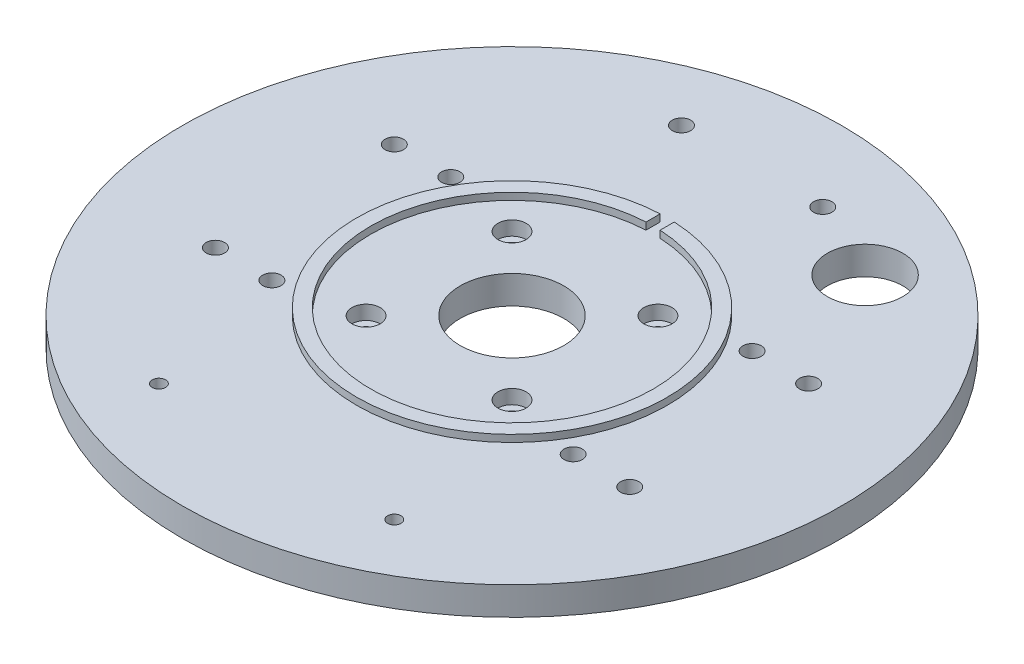
ISO-10303-21;
HEADER;
FILE_DESCRIPTION(('STEP AP214'),'2;1');
FILE_NAME('part.step','',(''),(''),'','','');
FILE_SCHEMA(('AUTOMOTIVE_DESIGN { 1 0 10303 214 1 1 1 1 }'));
ENDSEC;
DATA;
#1=APPLICATION_CONTEXT('core data for automotive mechanical design processes');
#2=APPLICATION_PROTOCOL_DEFINITION('international standard','automotive_design',2000,#1);
#3=PRODUCT_CONTEXT('',#1,'mechanical');
#4=PRODUCT('Part','Part','',(#3));
#5=PRODUCT_RELATED_PRODUCT_CATEGORY('part','',(#4));
#6=PRODUCT_DEFINITION_FORMATION('','',#4);
#7=PRODUCT_DEFINITION_CONTEXT('part definition',#1,'design');
#8=PRODUCT_DEFINITION('design','',#6,#7);
#9=PRODUCT_DEFINITION_SHAPE('','',#8);
#10=(LENGTH_UNIT() NAMED_UNIT(*) SI_UNIT(.MILLI.,.METRE.));
#11=(NAMED_UNIT(*) PLANE_ANGLE_UNIT() SI_UNIT($,.RADIAN.));
#12=(NAMED_UNIT(*) SI_UNIT($,.STERADIAN.) SOLID_ANGLE_UNIT());
#13=UNCERTAINTY_MEASURE_WITH_UNIT(LENGTH_MEASURE(1.E-05),#10,'distance_accuracy_value','');
#14=(GEOMETRIC_REPRESENTATION_CONTEXT(3) GLOBAL_UNCERTAINTY_ASSIGNED_CONTEXT((#13)) GLOBAL_UNIT_ASSIGNED_CONTEXT((#10,
#11,#12)) REPRESENTATION_CONTEXT('',''));
#15=CARTESIAN_POINT('',(0.,0.,0.));
#16=DIRECTION('',(0.,0.,1.));
#17=DIRECTION('',(1.,0.,0.));
#18=AXIS2_PLACEMENT_3D('',#15,#16,#17);
#19=CARTESIAN_POINT('',(13.,0.,-29.));
#20=DIRECTION('',(0.,1.,0.));
#21=DIRECTION('',(0.,0.,1.));
#22=AXIS2_PLACEMENT_3D('',#19,#20,#21);
#23=CYLINDRICAL_SURFACE('',#22,1.95);
#24=CARTESIAN_POINT('',(13.,0.,-29.));
#25=DIRECTION('',(0.,1.,0.));
#26=DIRECTION('',(0.,0.,1.));
#27=AXIS2_PLACEMENT_3D('',#24,#25,#26);
#28=CIRCLE('',#27,1.95);
#29=CARTESIAN_POINT('',(13.,0.,-27.05));
#30=VERTEX_POINT('',#29);
#31=EDGE_CURVE('E129',#30,#30,#28,.T.);
#32=ORIENTED_EDGE('',*,*,#31,.F.);
#33=EDGE_LOOP('',(#32));
#34=FACE_BOUND('',#33,.T.);
#35=CARTESIAN_POINT('',(13.,5.,-29.));
#36=DIRECTION('',(0.,1.,0.));
#37=DIRECTION('',(0.,0.,1.));
#38=AXIS2_PLACEMENT_3D('',#35,#36,#37);
#39=CIRCLE('',#38,1.95);
#40=CARTESIAN_POINT('',(13.,5.,-27.05));
#41=VERTEX_POINT('',#40);
#42=EDGE_CURVE('E11',#41,#41,#39,.F.);
#43=ORIENTED_EDGE('',*,*,#42,.F.);
#44=EDGE_LOOP('',(#43));
#45=FACE_BOUND('',#44,.T.);
#46=ADVANCED_FACE('F37',(#34,#45),#23,.F.);
#47=CARTESIAN_POINT('',(-15.4999999999997,-4.,15.5));
#48=DIRECTION('',(0.,1.,0.));
#49=DIRECTION('',(0.,0.,1.));
#50=AXIS2_PLACEMENT_3D('',#47,#48,#49);
#51=CYLINDRICAL_SURFACE('',#50,1.42);
#52=CARTESIAN_POINT('',(-15.4999999999997,0.,15.5));
#53=DIRECTION('',(0.,1.,0.));
#54=DIRECTION('',(0.,0.,1.));
#55=AXIS2_PLACEMENT_3D('',#52,#53,#54);
#56=CIRCLE('',#55,1.42);
#57=CARTESIAN_POINT('',(-15.4999999999997,0.,16.92));
#58=VERTEX_POINT('',#57);
#59=EDGE_CURVE('E210',#58,#58,#56,.T.);
#60=ORIENTED_EDGE('',*,*,#59,.F.);
#61=EDGE_LOOP('',(#60));
#62=FACE_BOUND('',#61,.T.);
#63=CARTESIAN_POINT('',(-15.4999999999997,3.,15.5));
#64=DIRECTION('',(0.,1.,0.));
#65=DIRECTION('',(0.,0.,1.));
#66=AXIS2_PLACEMENT_3D('',#63,#64,#65);
#67=CIRCLE('',#66,1.42);
#68=CARTESIAN_POINT('',(-15.4999999999997,3.,16.92));
#69=VERTEX_POINT('',#68);
#70=EDGE_CURVE('E194',#69,#69,#67,.F.);
#71=ORIENTED_EDGE('',*,*,#70,.F.);
#72=EDGE_LOOP('',(#71));
#73=FACE_BOUND('',#72,.T.);
#74=ADVANCED_FACE('F270',(#62,#73),#51,.F.);
#75=CARTESIAN_POINT('',(15.5000000000003,-4.,15.5));
#76=DIRECTION('',(0.,1.,0.));
#77=DIRECTION('',(0.,0.,1.));
#78=AXIS2_PLACEMENT_3D('',#75,#76,#77);
#79=CYLINDRICAL_SURFACE('',#78,1.42);
#80=CARTESIAN_POINT('',(15.5000000000003,0.,15.5));
#81=DIRECTION('',(0.,1.,0.));
#82=DIRECTION('',(0.,0.,1.));
#83=AXIS2_PLACEMENT_3D('',#80,#81,#82);
#84=CIRCLE('',#83,1.42);
#85=CARTESIAN_POINT('',(15.5000000000003,0.,16.92));
#86=VERTEX_POINT('',#85);
#87=EDGE_CURVE('E213',#86,#86,#84,.T.);
#88=ORIENTED_EDGE('',*,*,#87,.F.);
#89=EDGE_LOOP('',(#88));
#90=FACE_BOUND('',#89,.T.);
#91=CARTESIAN_POINT('',(15.5000000000003,3.,15.5));
#92=DIRECTION('',(0.,1.,0.));
#93=DIRECTION('',(0.,0.,1.));
#94=AXIS2_PLACEMENT_3D('',#91,#92,#93);
#95=CIRCLE('',#94,1.42);
#96=CARTESIAN_POINT('',(15.5000000000003,3.,16.92));
#97=VERTEX_POINT('',#96);
#98=EDGE_CURVE('E222',#97,#97,#95,.F.);
#99=ORIENTED_EDGE('',*,*,#98,.F.);
#100=EDGE_LOOP('',(#99));
#101=FACE_BOUND('',#100,.T.);
#102=ADVANCED_FACE('F276',(#90,#101),#79,.F.);
#103=CARTESIAN_POINT('',(15.5,-4.,-15.5));
#104=DIRECTION('',(0.,1.,0.));
#105=DIRECTION('',(0.,0.,1.));
#106=AXIS2_PLACEMENT_3D('',#103,#104,#105);
#107=CYLINDRICAL_SURFACE('',#106,1.42);
#108=CARTESIAN_POINT('',(15.5,0.,-15.5));
#109=DIRECTION('',(0.,1.,0.));
#110=DIRECTION('',(0.,0.,1.));
#111=AXIS2_PLACEMENT_3D('',#108,#109,#110);
#112=CIRCLE('',#111,1.42);
#113=CARTESIAN_POINT('',(15.5,0.,-14.08));
#114=VERTEX_POINT('',#113);
#115=EDGE_CURVE('E209',#114,#114,#112,.T.);
#116=ORIENTED_EDGE('',*,*,#115,.F.);
#117=EDGE_LOOP('',(#116));
#118=FACE_BOUND('',#117,.T.);
#119=CARTESIAN_POINT('',(15.5,3.,-15.5));
#120=DIRECTION('',(0.,1.,0.));
#121=DIRECTION('',(0.,0.,1.));
#122=AXIS2_PLACEMENT_3D('',#119,#120,#121);
#123=CIRCLE('',#122,1.42);
#124=CARTESIAN_POINT('',(15.5,3.,-14.08));
#125=VERTEX_POINT('',#124);
#126=EDGE_CURVE('E171',#125,#125,#123,.F.);
#127=ORIENTED_EDGE('',*,*,#126,.F.);
#128=EDGE_LOOP('',(#127));
#129=FACE_BOUND('',#128,.T.);
#130=ADVANCED_FACE('F350',(#118,#129),#107,.F.);
#131=CARTESIAN_POINT('',(-15.5,-4.,-15.5));
#132=DIRECTION('',(0.,1.,0.));
#133=DIRECTION('',(0.,0.,1.));
#134=AXIS2_PLACEMENT_3D('',#131,#132,#133);
#135=CYLINDRICAL_SURFACE('',#134,1.42);
#136=CARTESIAN_POINT('',(-15.5,0.,-15.5));
#137=DIRECTION('',(0.,1.,0.));
#138=DIRECTION('',(0.,0.,1.));
#139=AXIS2_PLACEMENT_3D('',#136,#137,#138);
#140=CIRCLE('',#139,1.42);
#141=CARTESIAN_POINT('',(-15.5,0.,-14.08));
#142=VERTEX_POINT('',#141);
#143=EDGE_CURVE('E204',#142,#142,#140,.T.);
#144=ORIENTED_EDGE('',*,*,#143,.F.);
#145=EDGE_LOOP('',(#144));
#146=FACE_BOUND('',#145,.T.);
#147=CARTESIAN_POINT('',(-15.5,3.,-15.5));
#148=DIRECTION('',(0.,1.,0.));
#149=DIRECTION('',(0.,0.,1.));
#150=AXIS2_PLACEMENT_3D('',#147,#148,#149);
#151=CIRCLE('',#150,1.42);
#152=CARTESIAN_POINT('',(-15.5,3.,-14.08));
#153=VERTEX_POINT('',#152);
#154=EDGE_CURVE('E190',#153,#153,#151,.F.);
#155=ORIENTED_EDGE('',*,*,#154,.F.);
#156=EDGE_LOOP('',(#155));
#157=FACE_BOUND('',#156,.T.);
#158=ADVANCED_FACE('F353',(#146,#157),#135,.F.);
#159=CARTESIAN_POINT('',(0.,6.,0.));
#160=DIRECTION('',(0.,-1.,0.));
#161=DIRECTION('',(0.,0.,-1.));
#162=AXIS2_PLACEMENT_3D('',#159,#160,#161);
#163=CYLINDRICAL_SURFACE('',#162,11.);
#164=CARTESIAN_POINT('',(0.,6.,0.));
#165=DIRECTION('',(0.,1.,0.));
#166=DIRECTION('',(0.,0.,1.));
#167=AXIS2_PLACEMENT_3D('',#164,#165,#166);
#168=CIRCLE('',#167,11.);
#169=CARTESIAN_POINT('',(0.,6.,11.));
#170=VERTEX_POINT('',#169);
#171=EDGE_CURVE('E195',#170,#170,#168,.T.);
#172=ORIENTED_EDGE('',*,*,#171,.T.);
#173=EDGE_LOOP('',(#172));
#174=FACE_BOUND('',#173,.T.);
#175=CARTESIAN_POINT('',(0.,0.,0.));
#176=DIRECTION('',(0.,1.,0.));
#177=DIRECTION('',(0.,0.,1.));
#178=AXIS2_PLACEMENT_3D('',#175,#176,#177);
#179=CIRCLE('',#178,11.);
#180=CARTESIAN_POINT('',(0.,0.,11.));
#181=VERTEX_POINT('',#180);
#182=EDGE_CURVE('E201',#181,#181,#179,.T.);
#183=ORIENTED_EDGE('',*,*,#182,.F.);
#184=EDGE_LOOP('',(#183));
#185=FACE_BOUND('',#184,.T.);
#186=ADVANCED_FACE('F39',(#174,#185),#163,.F.);
#187=CARTESIAN_POINT('',(0.,6.,0.));
#188=DIRECTION('',(0.,-1.,0.));
#189=DIRECTION('',(0.,0.,-1.));
#190=AXIS2_PLACEMENT_3D('',#187,#188,#189);
#191=CYLINDRICAL_SURFACE('',#190,70.);
#192=CARTESIAN_POINT('',(0.,6.,0.));
#193=DIRECTION('',(0.,1.,0.));
#194=DIRECTION('',(0.,0.,1.));
#195=AXIS2_PLACEMENT_3D('',#192,#193,#194);
#196=CIRCLE('',#195,70.);
#197=CARTESIAN_POINT('',(0.,6.,70.));
#198=VERTEX_POINT('',#197);
#199=EDGE_CURVE('E112',#198,#198,#196,.T.);
#200=ORIENTED_EDGE('',*,*,#199,.F.);
#201=EDGE_LOOP('',(#200));
#202=FACE_BOUND('',#201,.T.);
#203=CARTESIAN_POINT('',(0.,0.,0.));
#204=DIRECTION('',(0.,1.,0.));
#205=DIRECTION('',(0.,0.,1.));
#206=AXIS2_PLACEMENT_3D('',#203,#204,#205);
#207=CIRCLE('',#206,70.);
#208=CARTESIAN_POINT('',(0.,0.,70.));
#209=VERTEX_POINT('',#208);
#210=EDGE_CURVE('E198',#209,#209,#207,.T.);
#211=ORIENTED_EDGE('',*,*,#210,.T.);
#212=EDGE_LOOP('',(#211));
#213=FACE_BOUND('',#212,.T.);
#214=ADVANCED_FACE('F363',(#202,#213),#191,.T.);
#215=CARTESIAN_POINT('',(0.,6.,0.));
#216=DIRECTION('',(0.,1.,0.));
#217=DIRECTION('',(0.,0.,1.));
#218=AXIS2_PLACEMENT_3D('',#215,#216,#217);
#219=PLANE('',#218);
#220=DIRECTION('',(0.,0.,1.));
#221=VECTOR('',#220,1.);
#222=CARTESIAN_POINT('',(1.5,6.,-26.2041912737157));
#223=LINE('',#222,#221);
#224=CARTESIAN_POINT('',(1.5,6.,-32.9658914637539));
#225=VERTEX_POINT('',#224);
#226=CARTESIAN_POINT('',(1.5,6.,-29.9624765331573));
#227=VERTEX_POINT('',#226);
#228=EDGE_CURVE('E94',#225,#227,#223,.T.);
#229=ORIENTED_EDGE('',*,*,#228,.F.);
#230=CARTESIAN_POINT('',(0.,6.,0.));
#231=DIRECTION('',(0.,1.,0.));
#232=DIRECTION('',(0.,0.,1.));
#233=AXIS2_PLACEMENT_3D('',#230,#231,#232);
#234=CIRCLE('',#233,33.);
#235=CARTESIAN_POINT('',(-1.5,6.,-32.9658914637539));
#236=VERTEX_POINT('',#235);
#237=EDGE_CURVE('E79',#236,#225,#234,.T.);
#238=ORIENTED_EDGE('',*,*,#237,.F.);
#239=DIRECTION('',(0.,0.,-1.));
#240=VECTOR('',#239,1.);
#241=CARTESIAN_POINT('',(-1.5,6.,-26.2041912737157));
#242=LINE('',#241,#240);
#243=CARTESIAN_POINT('',(-1.5,6.,-29.9624765331573));
#244=VERTEX_POINT('',#243);
#245=EDGE_CURVE('E101',#244,#236,#242,.T.);
#246=ORIENTED_EDGE('',*,*,#245,.F.);
#247=CARTESIAN_POINT('',(0.,6.,0.));
#248=DIRECTION('',(0.,1.,0.));
#249=DIRECTION('',(0.,0.,1.));
#250=AXIS2_PLACEMENT_3D('',#247,#248,#249);
#251=CIRCLE('',#250,30.);
#252=EDGE_CURVE('E52',#244,#227,#251,.T.);
#253=ORIENTED_EDGE('',*,*,#252,.T.);
#254=EDGE_LOOP('',(#229,#238,#246,#253));
#255=FACE_BOUND('',#254,.T.);
#256=CARTESIAN_POINT('',(30.,6.,-45.));
#257=DIRECTION('',(0.,1.,0.));
#258=DIRECTION('',(0.,0.,1.));
#259=AXIS2_PLACEMENT_3D('',#256,#257,#258);
#260=CIRCLE('',#259,7.99999999999999);
#261=CARTESIAN_POINT('',(30.,6.,-37.));
#262=VERTEX_POINT('',#261);
#263=EDGE_CURVE('E113',#262,#262,#260,.T.);
#264=ORIENTED_EDGE('',*,*,#263,.F.);
#265=EDGE_LOOP('',(#264));
#266=FACE_BOUND('',#265,.T.);
#267=CARTESIAN_POINT('',(25.,6.,50.));
#268=DIRECTION('',(0.,1.,0.));
#269=DIRECTION('',(0.,0.,1.));
#270=AXIS2_PLACEMENT_3D('',#267,#268,#269);
#271=CIRCLE('',#270,1.42);
#272=CARTESIAN_POINT('',(25.,6.,51.42));
#273=VERTEX_POINT('',#272);
#274=EDGE_CURVE('E118',#273,#273,#271,.T.);
#275=ORIENTED_EDGE('',*,*,#274,.F.);
#276=EDGE_LOOP('',(#275));
#277=FACE_BOUND('',#276,.T.);
#278=CARTESIAN_POINT('',(-25.,6.,50.));
#279=DIRECTION('',(0.,1.,0.));
#280=DIRECTION('',(0.,0.,1.));
#281=AXIS2_PLACEMENT_3D('',#278,#279,#280);
#282=CIRCLE('',#281,1.42);
#283=CARTESIAN_POINT('',(-25.,6.,51.42));
#284=VERTEX_POINT('',#283);
#285=EDGE_CURVE('E122',#284,#284,#282,.T.);
#286=ORIENTED_EDGE('',*,*,#285,.F.);
#287=EDGE_LOOP('',(#286));
#288=FACE_BOUND('',#287,.T.);
#289=CARTESIAN_POINT('',(-17.,6.,-52.9998102883134));
#290=DIRECTION('',(0.,1.,0.));
#291=DIRECTION('',(0.,0.,1.));
#292=AXIS2_PLACEMENT_3D('',#289,#290,#291);
#293=CIRCLE('',#292,1.95);
#294=CARTESIAN_POINT('',(-17.,6.,-51.0498102883134));
#295=VERTEX_POINT('',#294);
#296=EDGE_CURVE('E130',#295,#295,#293,.T.);
#297=ORIENTED_EDGE('',*,*,#296,.F.);
#298=EDGE_LOOP('',(#297));
#299=FACE_BOUND('',#298,.T.);
#300=CARTESIAN_POINT('',(13.,6.,-53.));
#301=DIRECTION('',(0.,1.,0.));
#302=DIRECTION('',(0.,0.,1.));
#303=AXIS2_PLACEMENT_3D('',#300,#301,#302);
#304=CIRCLE('',#303,1.95);
#305=CARTESIAN_POINT('',(13.,6.,-51.05));
#306=VERTEX_POINT('',#305);
#307=EDGE_CURVE('E136',#306,#306,#304,.T.);
#308=ORIENTED_EDGE('',*,*,#307,.F.);
#309=EDGE_LOOP('',(#308));
#310=FACE_BOUND('',#309,.T.);
#311=CARTESIAN_POINT('',(-44.,6.,-18.9999999999999));
#312=DIRECTION('',(0.,1.,0.));
#313=DIRECTION('',(0.,0.,1.));
#314=AXIS2_PLACEMENT_3D('',#311,#312,#313);
#315=CIRCLE('',#314,1.95);
#316=CARTESIAN_POINT('',(-44.,6.,-17.0499999999999));
#317=VERTEX_POINT('',#316);
#318=EDGE_CURVE('E142',#317,#317,#315,.T.);
#319=ORIENTED_EDGE('',*,*,#318,.F.);
#320=EDGE_LOOP('',(#319));
#321=FACE_BOUND('',#320,.T.);
#322=CARTESIAN_POINT('',(-43.9999999999996,6.,19.0000000000001));
#323=DIRECTION('',(0.,1.,0.));
#324=DIRECTION('',(0.,0.,1.));
#325=AXIS2_PLACEMENT_3D('',#322,#323,#324);
#326=CIRCLE('',#325,1.95);
#327=CARTESIAN_POINT('',(-43.9999999999996,6.,20.9500000000001));
#328=VERTEX_POINT('',#327);
#329=EDGE_CURVE('E146',#328,#328,#326,.T.);
#330=ORIENTED_EDGE('',*,*,#329,.F.);
#331=EDGE_LOOP('',(#330));
#332=FACE_BOUND('',#331,.T.);
#333=CARTESIAN_POINT('',(-31.9999999999996,6.,19.));
#334=DIRECTION('',(0.,1.,0.));
#335=DIRECTION('',(0.,0.,1.));
#336=AXIS2_PLACEMENT_3D('',#333,#334,#335);
#337=CIRCLE('',#336,1.95);
#338=CARTESIAN_POINT('',(-31.9999999999996,6.,20.95));
#339=VERTEX_POINT('',#338);
#340=EDGE_CURVE('E149',#339,#339,#337,.T.);
#341=ORIENTED_EDGE('',*,*,#340,.F.);
#342=EDGE_LOOP('',(#341));
#343=FACE_BOUND('',#342,.T.);
#344=CARTESIAN_POINT('',(31.9999999999996,6.,19.));
#345=DIRECTION('',(0.,1.,0.));
#346=DIRECTION('',(0.,0.,-1.));
#347=AXIS2_PLACEMENT_3D('',#344,#345,#346);
#348=CIRCLE('',#347,1.95);
#349=CARTESIAN_POINT('',(31.9999999999996,6.,17.05));
#350=VERTEX_POINT('',#349);
#351=EDGE_CURVE('E152',#350,#350,#348,.T.);
#352=ORIENTED_EDGE('',*,*,#351,.F.);
#353=EDGE_LOOP('',(#352));
#354=FACE_BOUND('',#353,.T.);
#355=CARTESIAN_POINT('',(43.9999999999996,6.,19.0000000000001));
#356=DIRECTION('',(0.,1.,0.));
#357=DIRECTION('',(0.,0.,-1.));
#358=AXIS2_PLACEMENT_3D('',#355,#356,#357);
#359=CIRCLE('',#358,1.95);
#360=CARTESIAN_POINT('',(43.9999999999996,6.,17.0500000000001));
#361=VERTEX_POINT('',#360);
#362=EDGE_CURVE('E155',#361,#361,#359,.T.);
#363=ORIENTED_EDGE('',*,*,#362,.F.);
#364=EDGE_LOOP('',(#363));
#365=FACE_BOUND('',#364,.T.);
#366=CARTESIAN_POINT('',(44.,6.,-18.9999999999999));
#367=DIRECTION('',(0.,1.,0.));
#368=DIRECTION('',(0.,0.,-1.));
#369=AXIS2_PLACEMENT_3D('',#366,#367,#368);
#370=CIRCLE('',#369,1.95);
#371=CARTESIAN_POINT('',(44.,6.,-20.9499999999999));
#372=VERTEX_POINT('',#371);
#373=EDGE_CURVE('E158',#372,#372,#370,.T.);
#374=ORIENTED_EDGE('',*,*,#373,.F.);
#375=EDGE_LOOP('',(#374));
#376=FACE_BOUND('',#375,.T.);
#377=CARTESIAN_POINT('',(32.,6.,-19.));
#378=DIRECTION('',(0.,1.,0.));
#379=DIRECTION('',(0.,0.,-1.));
#380=AXIS2_PLACEMENT_3D('',#377,#378,#379);
#381=CIRCLE('',#380,1.95);
#382=CARTESIAN_POINT('',(32.,6.,-20.95));
#383=VERTEX_POINT('',#382);
#384=EDGE_CURVE('E141',#383,#383,#381,.T.);
#385=ORIENTED_EDGE('',*,*,#384,.F.);
#386=EDGE_LOOP('',(#385));
#387=FACE_BOUND('',#386,.T.);
#388=CARTESIAN_POINT('',(-32.,6.,-19.));
#389=DIRECTION('',(0.,1.,0.));
#390=DIRECTION('',(0.,0.,1.));
#391=AXIS2_PLACEMENT_3D('',#388,#389,#390);
#392=CIRCLE('',#391,1.95);
#393=CARTESIAN_POINT('',(-32.,6.,-17.05));
#394=VERTEX_POINT('',#393);
#395=EDGE_CURVE('E163',#394,#394,#392,.T.);
#396=ORIENTED_EDGE('',*,*,#395,.F.);
#397=EDGE_LOOP('',(#396));
#398=FACE_BOUND('',#397,.T.);
#399=ORIENTED_EDGE('',*,*,#199,.T.);
#400=EDGE_LOOP('',(#399));
#401=FACE_BOUND('',#400,.T.);
#402=ORIENTED_EDGE('',*,*,#171,.F.);
#403=EDGE_LOOP('',(#402));
#404=FACE_BOUND('',#403,.T.);
#405=CARTESIAN_POINT('',(-15.5,6.,-15.5));
#406=DIRECTION('',(0.,1.,0.));
#407=DIRECTION('',(0.,0.,1.));
#408=AXIS2_PLACEMENT_3D('',#405,#406,#407);
#409=CIRCLE('',#408,3.);
#410=CARTESIAN_POINT('',(-15.5,6.,-12.5));
#411=VERTEX_POINT('',#410);
#412=EDGE_CURVE('E191',#411,#411,#409,.T.);
#413=ORIENTED_EDGE('',*,*,#412,.F.);
#414=EDGE_LOOP('',(#413));
#415=FACE_BOUND('',#414,.T.);
#416=CARTESIAN_POINT('',(-15.4999999999997,6.,15.5));
#417=DIRECTION('',(0.,1.,0.));
#418=DIRECTION('',(0.,0.,1.));
#419=AXIS2_PLACEMENT_3D('',#416,#417,#418);
#420=CIRCLE('',#419,3.);
#421=CARTESIAN_POINT('',(-15.4999999999997,6.,18.5));
#422=VERTEX_POINT('',#421);
#423=EDGE_CURVE('E184',#422,#422,#420,.T.);
#424=ORIENTED_EDGE('',*,*,#423,.F.);
#425=EDGE_LOOP('',(#424));
#426=FACE_BOUND('',#425,.T.);
#427=CARTESIAN_POINT('',(15.5000000000003,6.,15.5));
#428=DIRECTION('',(0.,1.,0.));
#429=DIRECTION('',(0.,0.,1.));
#430=AXIS2_PLACEMENT_3D('',#427,#428,#429);
#431=CIRCLE('',#430,3.);
#432=CARTESIAN_POINT('',(15.5000000000003,6.,18.5));
#433=VERTEX_POINT('',#432);
#434=EDGE_CURVE('E178',#433,#433,#431,.T.);
#435=ORIENTED_EDGE('',*,*,#434,.F.);
#436=EDGE_LOOP('',(#435));
#437=FACE_BOUND('',#436,.T.);
#438=CARTESIAN_POINT('',(15.5,6.,-15.5));
#439=DIRECTION('',(0.,1.,0.));
#440=DIRECTION('',(0.,0.,1.));
#441=AXIS2_PLACEMENT_3D('',#438,#439,#440);
#442=CIRCLE('',#441,3.);
#443=CARTESIAN_POINT('',(15.5,6.,-12.5));
#444=VERTEX_POINT('',#443);
#445=EDGE_CURVE('E172',#444,#444,#442,.T.);
#446=ORIENTED_EDGE('',*,*,#445,.F.);
#447=EDGE_LOOP('',(#446));
#448=FACE_BOUND('',#447,.T.);
#449=ADVANCED_FACE('F99',(#255,#266,#277,#288,#299,#310,#321,#332,#343,#354,#365,#376,#387,#398,
#401,#404,#415,#426,#437,#448),#219,.T.);
#450=CARTESIAN_POINT('',(0.,0.,0.));
#451=DIRECTION('',(0.,1.,0.));
#452=DIRECTION('',(0.,0.,1.));
#453=AXIS2_PLACEMENT_3D('',#450,#451,#452);
#454=PLANE('',#453);
#455=CARTESIAN_POINT('',(30.,0.,-45.));
#456=DIRECTION('',(0.,1.,0.));
#457=DIRECTION('',(0.,0.,1.));
#458=AXIS2_PLACEMENT_3D('',#455,#456,#457);
#459=CIRCLE('',#458,7.99999999999999);
#460=CARTESIAN_POINT('',(30.,0.,-37.));
#461=VERTEX_POINT('',#460);
#462=EDGE_CURVE('E117',#461,#461,#459,.T.);
#463=ORIENTED_EDGE('',*,*,#462,.T.);
#464=EDGE_LOOP('',(#463));
#465=FACE_BOUND('',#464,.T.);
#466=CARTESIAN_POINT('',(25.,0.,50.));
#467=DIRECTION('',(0.,1.,0.));
#468=DIRECTION('',(0.,0.,1.));
#469=AXIS2_PLACEMENT_3D('',#466,#467,#468);
#470=CIRCLE('',#469,1.42);
#471=CARTESIAN_POINT('',(25.,0.,51.42));
#472=VERTEX_POINT('',#471);
#473=EDGE_CURVE('E121',#472,#472,#470,.T.);
#474=ORIENTED_EDGE('',*,*,#473,.T.);
#475=EDGE_LOOP('',(#474));
#476=FACE_BOUND('',#475,.T.);
#477=CARTESIAN_POINT('',(-25.,0.,50.));
#478=DIRECTION('',(0.,1.,0.));
#479=DIRECTION('',(0.,0.,1.));
#480=AXIS2_PLACEMENT_3D('',#477,#478,#479);
#481=CIRCLE('',#480,1.42);
#482=CARTESIAN_POINT('',(-25.,0.,51.42));
#483=VERTEX_POINT('',#482);
#484=EDGE_CURVE('E125',#483,#483,#481,.T.);
#485=ORIENTED_EDGE('',*,*,#484,.T.);
#486=EDGE_LOOP('',(#485));
#487=FACE_BOUND('',#486,.T.);
#488=CARTESIAN_POINT('',(-17.,0.,-52.9998102883134));
#489=DIRECTION('',(0.,1.,0.));
#490=DIRECTION('',(0.,0.,1.));
#491=AXIS2_PLACEMENT_3D('',#488,#489,#490);
#492=CIRCLE('',#491,1.95);
#493=CARTESIAN_POINT('',(-17.,0.,-51.0498102883134));
#494=VERTEX_POINT('',#493);
#495=EDGE_CURVE('E126',#494,#494,#492,.T.);
#496=ORIENTED_EDGE('',*,*,#495,.T.);
#497=EDGE_LOOP('',(#496));
#498=FACE_BOUND('',#497,.T.);
#499=CARTESIAN_POINT('',(13.,0.,-53.));
#500=DIRECTION('',(0.,1.,0.));
#501=DIRECTION('',(0.,0.,1.));
#502=AXIS2_PLACEMENT_3D('',#499,#500,#501);
#503=CIRCLE('',#502,1.95);
#504=CARTESIAN_POINT('',(13.,0.,-51.05));
#505=VERTEX_POINT('',#504);
#506=EDGE_CURVE('E133',#505,#505,#503,.T.);
#507=ORIENTED_EDGE('',*,*,#506,.T.);
#508=EDGE_LOOP('',(#507));
#509=FACE_BOUND('',#508,.T.);
#510=ORIENTED_EDGE('',*,*,#31,.T.);
#511=EDGE_LOOP('',(#510));
#512=FACE_BOUND('',#511,.T.);
#513=CARTESIAN_POINT('',(-44.,0.,-18.9999999999999));
#514=DIRECTION('',(0.,1.,0.));
#515=DIRECTION('',(0.,0.,1.));
#516=AXIS2_PLACEMENT_3D('',#513,#514,#515);
#517=CIRCLE('',#516,1.95);
#518=CARTESIAN_POINT('',(-44.,0.,-17.0499999999999));
#519=VERTEX_POINT('',#518);
#520=EDGE_CURVE('E167',#519,#519,#517,.T.);
#521=ORIENTED_EDGE('',*,*,#520,.T.);
#522=EDGE_LOOP('',(#521));
#523=FACE_BOUND('',#522,.T.);
#524=CARTESIAN_POINT('',(-43.9999999999996,0.,19.0000000000001));
#525=DIRECTION('',(0.,1.,0.));
#526=DIRECTION('',(0.,0.,1.));
#527=AXIS2_PLACEMENT_3D('',#524,#525,#526);
#528=CIRCLE('',#527,1.95);
#529=CARTESIAN_POINT('',(-43.9999999999996,0.,20.9500000000001));
#530=VERTEX_POINT('',#529);
#531=EDGE_CURVE('E243',#530,#530,#528,.T.);
#532=ORIENTED_EDGE('',*,*,#531,.T.);
#533=EDGE_LOOP('',(#532));
#534=FACE_BOUND('',#533,.T.);
#535=CARTESIAN_POINT('',(-31.9999999999996,0.,19.));
#536=DIRECTION('',(0.,1.,0.));
#537=DIRECTION('',(0.,0.,1.));
#538=AXIS2_PLACEMENT_3D('',#535,#536,#537);
#539=CIRCLE('',#538,1.95);
#540=CARTESIAN_POINT('',(-31.9999999999996,0.,20.95));
#541=VERTEX_POINT('',#540);
#542=EDGE_CURVE('E240',#541,#541,#539,.T.);
#543=ORIENTED_EDGE('',*,*,#542,.T.);
#544=EDGE_LOOP('',(#543));
#545=FACE_BOUND('',#544,.T.);
#546=CARTESIAN_POINT('',(31.9999999999996,0.,19.));
#547=DIRECTION('',(0.,1.,0.));
#548=DIRECTION('',(0.,0.,1.));
#549=AXIS2_PLACEMENT_3D('',#546,#547,#548);
#550=CIRCLE('',#549,1.95);
#551=CARTESIAN_POINT('',(31.9999999999996,0.,20.95));
#552=VERTEX_POINT('',#551);
#553=EDGE_CURVE('E237',#552,#552,#550,.T.);
#554=ORIENTED_EDGE('',*,*,#553,.T.);
#555=EDGE_LOOP('',(#554));
#556=FACE_BOUND('',#555,.T.);
#557=CARTESIAN_POINT('',(43.9999999999996,0.,19.0000000000001));
#558=DIRECTION('',(0.,1.,0.));
#559=DIRECTION('',(0.,0.,1.));
#560=AXIS2_PLACEMENT_3D('',#557,#558,#559);
#561=CIRCLE('',#560,1.95);
#562=CARTESIAN_POINT('',(43.9999999999996,0.,20.9500000000001));
#563=VERTEX_POINT('',#562);
#564=EDGE_CURVE('E234',#563,#563,#561,.T.);
#565=ORIENTED_EDGE('',*,*,#564,.T.);
#566=EDGE_LOOP('',(#565));
#567=FACE_BOUND('',#566,.T.);
#568=CARTESIAN_POINT('',(44.,0.,-18.9999999999999));
#569=DIRECTION('',(0.,1.,0.));
#570=DIRECTION('',(0.,0.,1.));
#571=AXIS2_PLACEMENT_3D('',#568,#569,#570);
#572=CIRCLE('',#571,1.95);
#573=CARTESIAN_POINT('',(44.,0.,-17.0499999999999));
#574=VERTEX_POINT('',#573);
#575=EDGE_CURVE('E231',#574,#574,#572,.T.);
#576=ORIENTED_EDGE('',*,*,#575,.T.);
#577=EDGE_LOOP('',(#576));
#578=FACE_BOUND('',#577,.T.);
#579=CARTESIAN_POINT('',(32.,0.,-19.));
#580=DIRECTION('',(0.,1.,0.));
#581=DIRECTION('',(0.,0.,1.));
#582=AXIS2_PLACEMENT_3D('',#579,#580,#581);
#583=CIRCLE('',#582,1.95);
#584=CARTESIAN_POINT('',(32.,0.,-17.05));
#585=VERTEX_POINT('',#584);
#586=EDGE_CURVE('E145',#585,#585,#583,.T.);
#587=ORIENTED_EDGE('',*,*,#586,.T.);
#588=EDGE_LOOP('',(#587));
#589=FACE_BOUND('',#588,.T.);
#590=CARTESIAN_POINT('',(-32.,0.,-19.));
#591=DIRECTION('',(0.,1.,0.));
#592=DIRECTION('',(0.,0.,1.));
#593=AXIS2_PLACEMENT_3D('',#590,#591,#592);
#594=CIRCLE('',#593,1.95);
#595=CARTESIAN_POINT('',(-32.,0.,-17.05));
#596=VERTEX_POINT('',#595);
#597=EDGE_CURVE('E166',#596,#596,#594,.T.);
#598=ORIENTED_EDGE('',*,*,#597,.T.);
#599=EDGE_LOOP('',(#598));
#600=FACE_BOUND('',#599,.T.);
#601=ORIENTED_EDGE('',*,*,#115,.T.);
#602=EDGE_LOOP('',(#601));
#603=FACE_BOUND('',#602,.T.);
#604=ORIENTED_EDGE('',*,*,#87,.T.);
#605=EDGE_LOOP('',(#604));
#606=FACE_BOUND('',#605,.T.);
#607=ORIENTED_EDGE('',*,*,#59,.T.);
#608=EDGE_LOOP('',(#607));
#609=FACE_BOUND('',#608,.T.);
#610=ORIENTED_EDGE('',*,*,#143,.T.);
#611=EDGE_LOOP('',(#610));
#612=FACE_BOUND('',#611,.T.);
#613=ORIENTED_EDGE('',*,*,#182,.T.);
#614=EDGE_LOOP('',(#613));
#615=FACE_BOUND('',#614,.T.);
#616=ORIENTED_EDGE('',*,*,#210,.F.);
#617=EDGE_LOOP('',(#616));
#618=FACE_BOUND('',#617,.T.);
#619=ADVANCED_FACE('F345',(#465,#476,#487,#498,#509,#512,#523,#534,#545,#556,#567,#578,#589,
#600,#603,#606,#609,#612,#615,#618),#454,.F.);
#620=CARTESIAN_POINT('',(-15.5,3.,-15.5));
#621=DIRECTION('',(0.,1.,0.));
#622=DIRECTION('',(0.,0.,1.));
#623=AXIS2_PLACEMENT_3D('',#620,#621,#622);
#624=PLANE('',#623);
#625=CARTESIAN_POINT('',(-15.5,3.,-15.5));
#626=DIRECTION('',(0.,1.,0.));
#627=DIRECTION('',(0.,0.,1.));
#628=AXIS2_PLACEMENT_3D('',#625,#626,#627);
#629=CIRCLE('',#628,3.);
#630=CARTESIAN_POINT('',(-15.5,3.,-12.5));
#631=VERTEX_POINT('',#630);
#632=EDGE_CURVE('E187',#631,#631,#629,.T.);
#633=ORIENTED_EDGE('',*,*,#632,.T.);
#634=EDGE_LOOP('',(#633));
#635=FACE_BOUND('',#634,.T.);
#636=ORIENTED_EDGE('',*,*,#154,.T.);
#637=EDGE_LOOP('',(#636));
#638=FACE_BOUND('',#637,.T.);
#639=ADVANCED_FACE('F342',(#635,#638),#624,.T.);
#640=CARTESIAN_POINT('',(-15.5,3.,-15.5));
#641=DIRECTION('',(0.,1.,0.));
#642=DIRECTION('',(0.,0.,1.));
#643=AXIS2_PLACEMENT_3D('',#640,#641,#642);
#644=CYLINDRICAL_SURFACE('',#643,3.);
#645=ORIENTED_EDGE('',*,*,#632,.F.);
#646=EDGE_LOOP('',(#645));
#647=FACE_BOUND('',#646,.T.);
#648=ORIENTED_EDGE('',*,*,#412,.T.);
#649=EDGE_LOOP('',(#648));
#650=FACE_BOUND('',#649,.T.);
#651=ADVANCED_FACE('F322',(#647,#650),#644,.F.);
#652=CARTESIAN_POINT('',(15.5,3.,-15.5));
#653=DIRECTION('',(0.,1.,0.));
#654=DIRECTION('',(0.,0.,1.));
#655=AXIS2_PLACEMENT_3D('',#652,#653,#654);
#656=PLANE('',#655);
#657=CARTESIAN_POINT('',(15.5,3.,-15.5));
#658=DIRECTION('',(0.,1.,0.));
#659=DIRECTION('',(0.,0.,1.));
#660=AXIS2_PLACEMENT_3D('',#657,#658,#659);
#661=CIRCLE('',#660,3.);
#662=CARTESIAN_POINT('',(15.5,3.,-12.5));
#663=VERTEX_POINT('',#662);
#664=EDGE_CURVE('E168',#663,#663,#661,.T.);
#665=ORIENTED_EDGE('',*,*,#664,.T.);
#666=EDGE_LOOP('',(#665));
#667=FACE_BOUND('',#666,.T.);
#668=ORIENTED_EDGE('',*,*,#126,.T.);
#669=EDGE_LOOP('',(#668));
#670=FACE_BOUND('',#669,.T.);
#671=ADVANCED_FACE('F318',(#667,#670),#656,.T.);
#672=CARTESIAN_POINT('',(15.5,3.,-15.5));
#673=DIRECTION('',(0.,1.,0.));
#674=DIRECTION('',(0.,0.,1.));
#675=AXIS2_PLACEMENT_3D('',#672,#673,#674);
#676=CYLINDRICAL_SURFACE('',#675,3.);
#677=ORIENTED_EDGE('',*,*,#664,.F.);
#678=EDGE_LOOP('',(#677));
#679=FACE_BOUND('',#678,.T.);
#680=ORIENTED_EDGE('',*,*,#445,.T.);
#681=EDGE_LOOP('',(#680));
#682=FACE_BOUND('',#681,.T.);
#683=ADVANCED_FACE('F321',(#679,#682),#676,.F.);
#684=CARTESIAN_POINT('',(15.5000000000003,3.,15.5));
#685=DIRECTION('',(0.,1.,0.));
#686=DIRECTION('',(0.,0.,1.));
#687=AXIS2_PLACEMENT_3D('',#684,#685,#686);
#688=PLANE('',#687);
#689=CARTESIAN_POINT('',(15.5000000000003,3.,15.5));
#690=DIRECTION('',(0.,1.,0.));
#691=DIRECTION('',(0.,0.,1.));
#692=AXIS2_PLACEMENT_3D('',#689,#690,#691);
#693=CIRCLE('',#692,3.);
#694=CARTESIAN_POINT('',(15.5000000000003,3.,18.5));
#695=VERTEX_POINT('',#694);
#696=EDGE_CURVE('E175',#695,#695,#693,.T.);
#697=ORIENTED_EDGE('',*,*,#696,.T.);
#698=EDGE_LOOP('',(#697));
#699=FACE_BOUND('',#698,.T.);
#700=ORIENTED_EDGE('',*,*,#98,.T.);
#701=EDGE_LOOP('',(#700));
#702=FACE_BOUND('',#701,.T.);
#703=ADVANCED_FACE('F326',(#699,#702),#688,.T.);
#704=CARTESIAN_POINT('',(15.5000000000003,3.,15.5));
#705=DIRECTION('',(0.,1.,0.));
#706=DIRECTION('',(0.,0.,1.));
#707=AXIS2_PLACEMENT_3D('',#704,#705,#706);
#708=CYLINDRICAL_SURFACE('',#707,3.);
#709=ORIENTED_EDGE('',*,*,#696,.F.);
#710=EDGE_LOOP('',(#709));
#711=FACE_BOUND('',#710,.T.);
#712=ORIENTED_EDGE('',*,*,#434,.T.);
#713=EDGE_LOOP('',(#712));
#714=FACE_BOUND('',#713,.T.);
#715=ADVANCED_FACE('F330',(#711,#714),#708,.F.);
#716=CARTESIAN_POINT('',(-15.4999999999997,3.,15.5));
#717=DIRECTION('',(0.,1.,0.));
#718=DIRECTION('',(0.,0.,1.));
#719=AXIS2_PLACEMENT_3D('',#716,#717,#718);
#720=PLANE('',#719);
#721=CARTESIAN_POINT('',(-15.4999999999997,3.,15.5));
#722=DIRECTION('',(0.,1.,0.));
#723=DIRECTION('',(0.,0.,1.));
#724=AXIS2_PLACEMENT_3D('',#721,#722,#723);
#725=CIRCLE('',#724,3.);
#726=CARTESIAN_POINT('',(-15.4999999999997,3.,18.5));
#727=VERTEX_POINT('',#726);
#728=EDGE_CURVE('E181',#727,#727,#725,.T.);
#729=ORIENTED_EDGE('',*,*,#728,.T.);
#730=EDGE_LOOP('',(#729));
#731=FACE_BOUND('',#730,.T.);
#732=ORIENTED_EDGE('',*,*,#70,.T.);
#733=EDGE_LOOP('',(#732));
#734=FACE_BOUND('',#733,.T.);
#735=ADVANCED_FACE('F334',(#731,#734),#720,.T.);
#736=CARTESIAN_POINT('',(-15.4999999999997,3.,15.5));
#737=DIRECTION('',(0.,1.,0.));
#738=DIRECTION('',(0.,0.,1.));
#739=AXIS2_PLACEMENT_3D('',#736,#737,#738);
#740=CYLINDRICAL_SURFACE('',#739,3.);
#741=ORIENTED_EDGE('',*,*,#728,.F.);
#742=EDGE_LOOP('',(#741));
#743=FACE_BOUND('',#742,.T.);
#744=ORIENTED_EDGE('',*,*,#423,.T.);
#745=EDGE_LOOP('',(#744));
#746=FACE_BOUND('',#745,.T.);
#747=ADVANCED_FACE('F316',(#743,#746),#740,.F.);
#748=CARTESIAN_POINT('',(-32.,-4.,-19.));
#749=DIRECTION('',(0.,1.,0.));
#750=DIRECTION('',(0.,0.,1.));
#751=AXIS2_PLACEMENT_3D('',#748,#749,#750);
#752=CYLINDRICAL_SURFACE('',#751,1.95);
#753=ORIENTED_EDGE('',*,*,#395,.T.);
#754=EDGE_LOOP('',(#753));
#755=FACE_BOUND('',#754,.T.);
#756=ORIENTED_EDGE('',*,*,#597,.F.);
#757=EDGE_LOOP('',(#756));
#758=FACE_BOUND('',#757,.T.);
#759=ADVANCED_FACE('F312',(#755,#758),#752,.F.);
#760=CARTESIAN_POINT('',(32.,-4.,-19.));
#761=DIRECTION('',(0.,1.,0.));
#762=DIRECTION('',(0.,0.,1.));
#763=AXIS2_PLACEMENT_3D('',#760,#761,#762);
#764=CYLINDRICAL_SURFACE('',#763,1.95);
#765=ORIENTED_EDGE('',*,*,#384,.T.);
#766=EDGE_LOOP('',(#765));
#767=FACE_BOUND('',#766,.T.);
#768=ORIENTED_EDGE('',*,*,#586,.F.);
#769=EDGE_LOOP('',(#768));
#770=FACE_BOUND('',#769,.T.);
#771=ADVANCED_FACE('F308',(#767,#770),#764,.F.);
#772=CARTESIAN_POINT('',(44.,-4.,-18.9999999999999));
#773=DIRECTION('',(0.,1.,0.));
#774=DIRECTION('',(0.,0.,1.));
#775=AXIS2_PLACEMENT_3D('',#772,#773,#774);
#776=CYLINDRICAL_SURFACE('',#775,1.95);
#777=ORIENTED_EDGE('',*,*,#373,.T.);
#778=EDGE_LOOP('',(#777));
#779=FACE_BOUND('',#778,.T.);
#780=ORIENTED_EDGE('',*,*,#575,.F.);
#781=EDGE_LOOP('',(#780));
#782=FACE_BOUND('',#781,.T.);
#783=ADVANCED_FACE('F304',(#779,#782),#776,.F.);
#784=CARTESIAN_POINT('',(43.9999999999996,-4.,19.0000000000001));
#785=DIRECTION('',(0.,1.,0.));
#786=DIRECTION('',(0.,0.,1.));
#787=AXIS2_PLACEMENT_3D('',#784,#785,#786);
#788=CYLINDRICAL_SURFACE('',#787,1.95);
#789=ORIENTED_EDGE('',*,*,#362,.T.);
#790=EDGE_LOOP('',(#789));
#791=FACE_BOUND('',#790,.T.);
#792=ORIENTED_EDGE('',*,*,#564,.F.);
#793=EDGE_LOOP('',(#792));
#794=FACE_BOUND('',#793,.T.);
#795=ADVANCED_FACE('F300',(#791,#794),#788,.F.);
#796=CARTESIAN_POINT('',(31.9999999999996,-4.,19.));
#797=DIRECTION('',(0.,1.,0.));
#798=DIRECTION('',(0.,0.,1.));
#799=AXIS2_PLACEMENT_3D('',#796,#797,#798);
#800=CYLINDRICAL_SURFACE('',#799,1.95);
#801=ORIENTED_EDGE('',*,*,#351,.T.);
#802=EDGE_LOOP('',(#801));
#803=FACE_BOUND('',#802,.T.);
#804=ORIENTED_EDGE('',*,*,#553,.F.);
#805=EDGE_LOOP('',(#804));
#806=FACE_BOUND('',#805,.T.);
#807=ADVANCED_FACE('F296',(#803,#806),#800,.F.);
#808=CARTESIAN_POINT('',(-31.9999999999996,-4.,19.));
#809=DIRECTION('',(0.,1.,0.));
#810=DIRECTION('',(0.,0.,1.));
#811=AXIS2_PLACEMENT_3D('',#808,#809,#810);
#812=CYLINDRICAL_SURFACE('',#811,1.95);
#813=ORIENTED_EDGE('',*,*,#340,.T.);
#814=EDGE_LOOP('',(#813));
#815=FACE_BOUND('',#814,.T.);
#816=ORIENTED_EDGE('',*,*,#542,.F.);
#817=EDGE_LOOP('',(#816));
#818=FACE_BOUND('',#817,.T.);
#819=ADVANCED_FACE('F292',(#815,#818),#812,.F.);
#820=CARTESIAN_POINT('',(-43.9999999999996,-4.,19.0000000000001));
#821=DIRECTION('',(0.,1.,0.));
#822=DIRECTION('',(0.,0.,1.));
#823=AXIS2_PLACEMENT_3D('',#820,#821,#822);
#824=CYLINDRICAL_SURFACE('',#823,1.95);
#825=ORIENTED_EDGE('',*,*,#329,.T.);
#826=EDGE_LOOP('',(#825));
#827=FACE_BOUND('',#826,.T.);
#828=ORIENTED_EDGE('',*,*,#531,.F.);
#829=EDGE_LOOP('',(#828));
#830=FACE_BOUND('',#829,.T.);
#831=ADVANCED_FACE('F288',(#827,#830),#824,.F.);
#832=CARTESIAN_POINT('',(-44.,-4.,-18.9999999999999));
#833=DIRECTION('',(0.,1.,0.));
#834=DIRECTION('',(0.,0.,1.));
#835=AXIS2_PLACEMENT_3D('',#832,#833,#834);
#836=CYLINDRICAL_SURFACE('',#835,1.95);
#837=ORIENTED_EDGE('',*,*,#318,.T.);
#838=EDGE_LOOP('',(#837));
#839=FACE_BOUND('',#838,.T.);
#840=ORIENTED_EDGE('',*,*,#520,.F.);
#841=EDGE_LOOP('',(#840));
#842=FACE_BOUND('',#841,.T.);
#843=ADVANCED_FACE('F285',(#839,#842),#836,.F.);
#844=CARTESIAN_POINT('',(13.,0.,-53.));
#845=DIRECTION('',(0.,1.,0.));
#846=DIRECTION('',(0.,0.,1.));
#847=AXIS2_PLACEMENT_3D('',#844,#845,#846);
#848=CYLINDRICAL_SURFACE('',#847,1.95);
#849=ORIENTED_EDGE('',*,*,#506,.F.);
#850=EDGE_LOOP('',(#849));
#851=FACE_BOUND('',#850,.T.);
#852=ORIENTED_EDGE('',*,*,#307,.T.);
#853=EDGE_LOOP('',(#852));
#854=FACE_BOUND('',#853,.T.);
#855=ADVANCED_FACE('F283',(#851,#854),#848,.F.);
#856=CARTESIAN_POINT('',(-17.,0.,-52.9998102883134));
#857=DIRECTION('',(0.,1.,0.));
#858=DIRECTION('',(0.,0.,1.));
#859=AXIS2_PLACEMENT_3D('',#856,#857,#858);
#860=CYLINDRICAL_SURFACE('',#859,1.95);
#861=ORIENTED_EDGE('',*,*,#495,.F.);
#862=EDGE_LOOP('',(#861));
#863=FACE_BOUND('',#862,.T.);
#864=ORIENTED_EDGE('',*,*,#296,.T.);
#865=EDGE_LOOP('',(#864));
#866=FACE_BOUND('',#865,.T.);
#867=ADVANCED_FACE('F513',(#863,#866),#860,.F.);
#868=CARTESIAN_POINT('',(-25.,-4.,50.));
#869=DIRECTION('',(0.,1.,0.));
#870=DIRECTION('',(0.,0.,1.));
#871=AXIS2_PLACEMENT_3D('',#868,#869,#870);
#872=CYLINDRICAL_SURFACE('',#871,1.42);
#873=ORIENTED_EDGE('',*,*,#285,.T.);
#874=EDGE_LOOP('',(#873));
#875=FACE_BOUND('',#874,.T.);
#876=ORIENTED_EDGE('',*,*,#484,.F.);
#877=EDGE_LOOP('',(#876));
#878=FACE_BOUND('',#877,.T.);
#879=ADVANCED_FACE('F510',(#875,#878),#872,.F.);
#880=CARTESIAN_POINT('',(25.,-4.,50.));
#881=DIRECTION('',(0.,1.,0.));
#882=DIRECTION('',(0.,0.,1.));
#883=AXIS2_PLACEMENT_3D('',#880,#881,#882);
#884=CYLINDRICAL_SURFACE('',#883,1.42);
#885=ORIENTED_EDGE('',*,*,#274,.T.);
#886=EDGE_LOOP('',(#885));
#887=FACE_BOUND('',#886,.T.);
#888=ORIENTED_EDGE('',*,*,#473,.F.);
#889=EDGE_LOOP('',(#888));
#890=FACE_BOUND('',#889,.T.);
#891=ADVANCED_FACE('F447',(#887,#890),#884,.F.);
#892=CARTESIAN_POINT('',(30.,-4.,-45.));
#893=DIRECTION('',(0.,1.,0.));
#894=DIRECTION('',(0.,0.,1.));
#895=AXIS2_PLACEMENT_3D('',#892,#893,#894);
#896=CYLINDRICAL_SURFACE('',#895,7.99999999999999);
#897=ORIENTED_EDGE('',*,*,#263,.T.);
#898=EDGE_LOOP('',(#897));
#899=FACE_BOUND('',#898,.T.);
#900=ORIENTED_EDGE('',*,*,#462,.F.);
#901=EDGE_LOOP('',(#900));
#902=FACE_BOUND('',#901,.T.);
#903=ADVANCED_FACE('F452',(#899,#902),#896,.F.);
#904=CARTESIAN_POINT('',(0.,7.5,0.));
#905=DIRECTION('',(0.,1.,0.));
#906=DIRECTION('',(0.,0.,1.));
#907=AXIS2_PLACEMENT_3D('',#904,#905,#906);
#908=PLANE('',#907);
#909=DIRECTION('',(0.,0.,-1.));
#910=VECTOR('',#909,1.);
#911=CARTESIAN_POINT('',(1.5,7.5,-26.2041912737157));
#912=LINE('',#911,#910);
#913=CARTESIAN_POINT('',(1.5,7.5,-29.9624765331573));
#914=VERTEX_POINT('',#913);
#915=CARTESIAN_POINT('',(1.5,7.5,-32.9658914637539));
#916=VERTEX_POINT('',#915);
#917=EDGE_CURVE('E96',#914,#916,#912,.T.);
#918=ORIENTED_EDGE('',*,*,#917,.F.);
#919=CARTESIAN_POINT('',(0.,7.5,0.));
#920=DIRECTION('',(0.,1.,0.));
#921=DIRECTION('',(0.,0.,1.));
#922=AXIS2_PLACEMENT_3D('',#919,#920,#921);
#923=CIRCLE('',#922,30.);
#924=CARTESIAN_POINT('',(-1.5,7.5,-29.9624765331573));
#925=VERTEX_POINT('',#924);
#926=EDGE_CURVE('E97',#925,#914,#923,.T.);
#927=ORIENTED_EDGE('',*,*,#926,.F.);
#928=DIRECTION('',(0.,0.,1.));
#929=VECTOR('',#928,1.);
#930=CARTESIAN_POINT('',(-1.5,7.5,-26.2041912737157));
#931=LINE('',#930,#929);
#932=CARTESIAN_POINT('',(-1.5,7.5,-32.9658914637539));
#933=VERTEX_POINT('',#932);
#934=EDGE_CURVE('E60',#933,#925,#931,.T.);
#935=ORIENTED_EDGE('',*,*,#934,.F.);
#936=CARTESIAN_POINT('',(0.,7.5,0.));
#937=DIRECTION('',(0.,1.,0.));
#938=DIRECTION('',(0.,0.,1.));
#939=AXIS2_PLACEMENT_3D('',#936,#937,#938);
#940=CIRCLE('',#939,33.);
#941=EDGE_CURVE('E110',#933,#916,#940,.T.);
#942=ORIENTED_EDGE('',*,*,#941,.T.);
#943=EDGE_LOOP('',(#918,#927,#935,#942));
#944=FACE_BOUND('',#943,.T.);
#945=ADVANCED_FACE('F256',(#944),#908,.T.);
#946=CARTESIAN_POINT('',(0.,7.5,0.));
#947=DIRECTION('',(0.,-1.,0.));
#948=DIRECTION('',(0.,0.,-1.));
#949=AXIS2_PLACEMENT_3D('',#946,#947,#948);
#950=CYLINDRICAL_SURFACE('',#949,33.);
#951=ORIENTED_EDGE('',*,*,#237,.T.);
#952=DIRECTION('',(0.,-1.,0.));
#953=VECTOR('',#952,1.);
#954=CARTESIAN_POINT('',(1.5,7.5,-32.9658914637539));
#955=LINE('',#954,#953);
#956=EDGE_CURVE('E83',#225,#916,#955,.F.);
#957=ORIENTED_EDGE('',*,*,#956,.T.);
#958=ORIENTED_EDGE('',*,*,#941,.F.);
#959=DIRECTION('',(0.,-1.,0.));
#960=VECTOR('',#959,1.);
#961=CARTESIAN_POINT('',(-1.5,7.5,-32.9658914637539));
#962=LINE('',#961,#960);
#963=EDGE_CURVE('E85',#933,#236,#962,.T.);
#964=ORIENTED_EDGE('',*,*,#963,.T.);
#965=EDGE_LOOP('',(#951,#957,#958,#964));
#966=FACE_BOUND('',#965,.T.);
#967=ADVANCED_FACE('F81',(#966),#950,.T.);
#968=CARTESIAN_POINT('',(0.,7.5,0.));
#969=DIRECTION('',(0.,-1.,0.));
#970=DIRECTION('',(0.,0.,-1.));
#971=AXIS2_PLACEMENT_3D('',#968,#969,#970);
#972=CYLINDRICAL_SURFACE('',#971,30.);
#973=DIRECTION('',(0.,-1.,0.));
#974=VECTOR('',#973,1.);
#975=CARTESIAN_POINT('',(1.5,7.5,-29.9624765331573));
#976=LINE('',#975,#974);
#977=EDGE_CURVE('E45',#227,#914,#976,.F.);
#978=ORIENTED_EDGE('',*,*,#977,.F.);
#979=ORIENTED_EDGE('',*,*,#252,.F.);
#980=DIRECTION('',(0.,-1.,0.));
#981=VECTOR('',#980,1.);
#982=CARTESIAN_POINT('',(-1.5,7.5,-29.9624765331573));
#983=LINE('',#982,#981);
#984=EDGE_CURVE('E89',#925,#244,#983,.T.);
#985=ORIENTED_EDGE('',*,*,#984,.F.);
#986=ORIENTED_EDGE('',*,*,#926,.T.);
#987=EDGE_LOOP('',(#978,#979,#985,#986));
#988=FACE_BOUND('',#987,.T.);
#989=ADVANCED_FACE('F257',(#988),#972,.F.);
#990=CARTESIAN_POINT('',(1.5,-5.2685220264052,-26.2041912737157));
#991=DIRECTION('',(1.,0.,0.));
#992=DIRECTION('',(0.,0.,-1.));
#993=AXIS2_PLACEMENT_3D('',#990,#991,#992);
#994=PLANE('',#993);
#995=ORIENTED_EDGE('',*,*,#228,.T.);
#996=ORIENTED_EDGE('',*,*,#977,.T.);
#997=ORIENTED_EDGE('',*,*,#917,.T.);
#998=ORIENTED_EDGE('',*,*,#956,.F.);
#999=EDGE_LOOP('',(#995,#996,#997,#998));
#1000=FACE_BOUND('',#999,.T.);
#1001=ADVANCED_FACE('F93',(#1000),#994,.F.);
#1002=CARTESIAN_POINT('',(-1.5,-5.2685220264052,-26.2041912737157));
#1003=DIRECTION('',(-1.,0.,0.));
#1004=DIRECTION('',(0.,0.,1.));
#1005=AXIS2_PLACEMENT_3D('',#1002,#1003,#1004);
#1006=PLANE('',#1005);
#1007=ORIENTED_EDGE('',*,*,#934,.T.);
#1008=ORIENTED_EDGE('',*,*,#984,.T.);
#1009=ORIENTED_EDGE('',*,*,#245,.T.);
#1010=ORIENTED_EDGE('',*,*,#963,.F.);
#1011=EDGE_LOOP('',(#1007,#1008,#1009,#1010));
#1012=FACE_BOUND('',#1011,.T.);
#1013=ADVANCED_FACE('F258',(#1012),#1006,.F.);
#1014=CARTESIAN_POINT('',(13.,5.,-29.));
#1015=DIRECTION('',(0.,1.,0.));
#1016=DIRECTION('',(0.,0.,1.));
#1017=AXIS2_PLACEMENT_3D('',#1014,#1015,#1016);
#1018=PLANE('',#1017);
#1019=ORIENTED_EDGE('',*,*,#42,.T.);
#1020=EDGE_LOOP('',(#1019));
#1021=FACE_BOUND('',#1020,.T.);
#1022=ADVANCED_FACE('F260',(#1021),#1018,.F.);
#1023=CLOSED_SHELL('',(#46,#74,#102,#130,#158,#186,#214,#449,#619,#639,#651,#671,#683,#703,#715,
#735,#747,#759,#771,#783,#795,#807,#819,#831,#843,#855,#867,#879,#891,#903,#945,#967,#989,#1001,
#1013,#1022));
#1024=MANIFOLD_SOLID_BREP('B2',#1023);
#1025=ADVANCED_BREP_SHAPE_REPRESENTATION('',(#18,#1024),#14);
#1026=SHAPE_DEFINITION_REPRESENTATION(#9,#1025);
ENDSEC;
END-ISO-10303-21;
